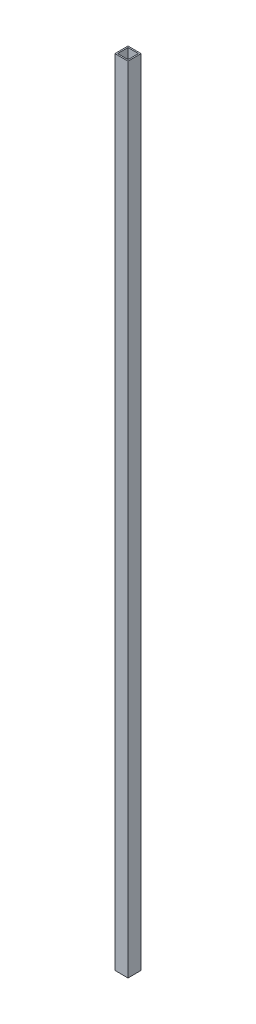
ISO-10303-21;
HEADER;
FILE_DESCRIPTION(('STEP AP214'),'2;1');
FILE_NAME('part.step','',(''),(''),'','','');
FILE_SCHEMA(('AUTOMOTIVE_DESIGN { 1 0 10303 214 1 1 1 1 }'));
ENDSEC;
DATA;
#1=APPLICATION_CONTEXT('core data for automotive mechanical design processes');
#2=APPLICATION_PROTOCOL_DEFINITION('international standard','automotive_design',2000,#1);
#3=PRODUCT_CONTEXT('',#1,'mechanical');
#4=PRODUCT('Part','Part','',(#3));
#5=PRODUCT_RELATED_PRODUCT_CATEGORY('part','',(#4));
#6=PRODUCT_DEFINITION_FORMATION('','',#4);
#7=PRODUCT_DEFINITION_CONTEXT('part definition',#1,'design');
#8=PRODUCT_DEFINITION('design','',#6,#7);
#9=PRODUCT_DEFINITION_SHAPE('','',#8);
#10=(LENGTH_UNIT() NAMED_UNIT(*) SI_UNIT(.MILLI.,.METRE.));
#11=(NAMED_UNIT(*) PLANE_ANGLE_UNIT() SI_UNIT($,.RADIAN.));
#12=(NAMED_UNIT(*) SI_UNIT($,.STERADIAN.) SOLID_ANGLE_UNIT());
#13=UNCERTAINTY_MEASURE_WITH_UNIT(LENGTH_MEASURE(1.E-05),#10,'distance_accuracy_value','');
#14=(GEOMETRIC_REPRESENTATION_CONTEXT(3) GLOBAL_UNCERTAINTY_ASSIGNED_CONTEXT((#13)) GLOBAL_UNIT_ASSIGNED_CONTEXT((#10,
#11,#12)) REPRESENTATION_CONTEXT('',''));
#15=CARTESIAN_POINT('',(0.,0.,0.));
#16=DIRECTION('',(0.,0.,1.));
#17=DIRECTION('',(1.,0.,0.));
#18=AXIS2_PLACEMENT_3D('',#15,#16,#17);
#19=CARTESIAN_POINT('',(0.,605.,0.));
#20=DIRECTION('',(0.,1.,0.));
#21=DIRECTION('',(0.,0.,1.));
#22=AXIS2_PLACEMENT_3D('',#19,#20,#21);
#23=PLANE('',#22);
#24=DIRECTION('',(0.,0.,-1.));
#25=VECTOR('',#24,1.);
#26=CARTESIAN_POINT('',(5.,605.,-5.));
#27=LINE('',#26,#25);
#28=CARTESIAN_POINT('',(5.,605.,5.));
#29=VERTEX_POINT('',#28);
#30=CARTESIAN_POINT('',(5.,605.,-5.));
#31=VERTEX_POINT('',#30);
#32=EDGE_CURVE('E139',#29,#31,#27,.T.);
#33=ORIENTED_EDGE('',*,*,#32,.T.);
#34=DIRECTION('',(-1.,0.,0.));
#35=VECTOR('',#34,1.);
#36=CARTESIAN_POINT('',(-5.,605.,-5.));
#37=LINE('',#36,#35);
#38=CARTESIAN_POINT('',(-5.,605.,-5.));
#39=VERTEX_POINT('',#38);
#40=EDGE_CURVE('E142',#31,#39,#37,.T.);
#41=ORIENTED_EDGE('',*,*,#40,.T.);
#42=DIRECTION('',(0.,0.,1.));
#43=VECTOR('',#42,1.);
#44=CARTESIAN_POINT('',(-5.,605.,-5.));
#45=LINE('',#44,#43);
#46=CARTESIAN_POINT('',(-5.,605.,5.));
#47=VERTEX_POINT('',#46);
#48=EDGE_CURVE('E145',#39,#47,#45,.T.);
#49=ORIENTED_EDGE('',*,*,#48,.T.);
#50=DIRECTION('',(1.,0.,0.));
#51=VECTOR('',#50,1.);
#52=CARTESIAN_POINT('',(-5.,605.,5.));
#53=LINE('',#52,#51);
#54=EDGE_CURVE('E147',#47,#29,#53,.T.);
#55=ORIENTED_EDGE('',*,*,#54,.T.);
#56=EDGE_LOOP('',(#33,#41,#49,#55));
#57=FACE_BOUND('',#56,.T.);
#58=DIRECTION('',(-1.,0.,0.));
#59=VECTOR('',#58,1.);
#60=CARTESIAN_POINT('',(-4.,605.,-4.));
#61=LINE('',#60,#59);
#62=CARTESIAN_POINT('',(4.,605.,-4.));
#63=VERTEX_POINT('',#62);
#64=CARTESIAN_POINT('',(-4.,605.,-4.));
#65=VERTEX_POINT('',#64);
#66=EDGE_CURVE('E109',#63,#65,#61,.T.);
#67=ORIENTED_EDGE('',*,*,#66,.F.);
#68=DIRECTION('',(0.,0.,-1.));
#69=VECTOR('',#68,1.);
#70=CARTESIAN_POINT('',(4.,605.,-4.));
#71=LINE('',#70,#69);
#72=CARTESIAN_POINT('',(4.,605.,4.));
#73=VERTEX_POINT('',#72);
#74=EDGE_CURVE('E101',#73,#63,#71,.T.);
#75=ORIENTED_EDGE('',*,*,#74,.F.);
#76=DIRECTION('',(1.,0.,0.));
#77=VECTOR('',#76,1.);
#78=CARTESIAN_POINT('',(-4.,605.,4.));
#79=LINE('',#78,#77);
#80=CARTESIAN_POINT('',(-4.,605.,4.));
#81=VERTEX_POINT('',#80);
#82=EDGE_CURVE('E123',#81,#73,#79,.T.);
#83=ORIENTED_EDGE('',*,*,#82,.F.);
#84=DIRECTION('',(0.,0.,1.));
#85=VECTOR('',#84,1.);
#86=CARTESIAN_POINT('',(-4.,605.,-4.));
#87=LINE('',#86,#85);
#88=EDGE_CURVE('E121',#65,#81,#87,.T.);
#89=ORIENTED_EDGE('',*,*,#88,.F.);
#90=EDGE_LOOP('',(#67,#75,#83,#89));
#91=FACE_BOUND('',#90,.T.);
#92=ADVANCED_FACE('F36',(#57,#91),#23,.T.);
#93=CARTESIAN_POINT('',(0.,0.,0.));
#94=DIRECTION('',(0.,1.,0.));
#95=DIRECTION('',(0.,0.,1.));
#96=AXIS2_PLACEMENT_3D('',#93,#94,#95);
#97=PLANE('',#96);
#98=DIRECTION('',(0.,0.,-1.));
#99=VECTOR('',#98,1.);
#100=CARTESIAN_POINT('',(5.,0.,-5.));
#101=LINE('',#100,#99);
#102=CARTESIAN_POINT('',(5.,0.,5.));
#103=VERTEX_POINT('',#102);
#104=CARTESIAN_POINT('',(5.,0.,-5.));
#105=VERTEX_POINT('',#104);
#106=EDGE_CURVE('E117',#103,#105,#101,.T.);
#107=ORIENTED_EDGE('',*,*,#106,.F.);
#108=DIRECTION('',(1.,0.,0.));
#109=VECTOR('',#108,1.);
#110=CARTESIAN_POINT('',(-5.,0.,5.));
#111=LINE('',#110,#109);
#112=CARTESIAN_POINT('',(-5.,0.,5.));
#113=VERTEX_POINT('',#112);
#114=EDGE_CURVE('E143',#113,#103,#111,.T.);
#115=ORIENTED_EDGE('',*,*,#114,.F.);
#116=DIRECTION('',(0.,0.,1.));
#117=VECTOR('',#116,1.);
#118=CARTESIAN_POINT('',(-5.,0.,-5.));
#119=LINE('',#118,#117);
#120=CARTESIAN_POINT('',(-5.,0.,-5.));
#121=VERTEX_POINT('',#120);
#122=EDGE_CURVE('E154',#121,#113,#119,.T.);
#123=ORIENTED_EDGE('',*,*,#122,.F.);
#124=DIRECTION('',(-1.,0.,0.));
#125=VECTOR('',#124,1.);
#126=CARTESIAN_POINT('',(-5.,0.,-5.));
#127=LINE('',#126,#125);
#128=EDGE_CURVE('E152',#105,#121,#127,.T.);
#129=ORIENTED_EDGE('',*,*,#128,.F.);
#130=EDGE_LOOP('',(#107,#115,#123,#129));
#131=FACE_BOUND('',#130,.T.);
#132=DIRECTION('',(0.,0.,-1.));
#133=VECTOR('',#132,1.);
#134=CARTESIAN_POINT('',(4.,0.,-4.));
#135=LINE('',#134,#133);
#136=CARTESIAN_POINT('',(4.,0.,4.));
#137=VERTEX_POINT('',#136);
#138=CARTESIAN_POINT('',(4.,0.,-4.));
#139=VERTEX_POINT('',#138);
#140=EDGE_CURVE('E59',#137,#139,#135,.T.);
#141=ORIENTED_EDGE('',*,*,#140,.T.);
#142=DIRECTION('',(-1.,0.,0.));
#143=VECTOR('',#142,1.);
#144=CARTESIAN_POINT('',(-4.,0.,-4.));
#145=LINE('',#144,#143);
#146=CARTESIAN_POINT('',(-4.,0.,-4.));
#147=VERTEX_POINT('',#146);
#148=EDGE_CURVE('E116',#139,#147,#145,.T.);
#149=ORIENTED_EDGE('',*,*,#148,.T.);
#150=DIRECTION('',(0.,0.,1.));
#151=VECTOR('',#150,1.);
#152=CARTESIAN_POINT('',(-4.,0.,-4.));
#153=LINE('',#152,#151);
#154=CARTESIAN_POINT('',(-4.,0.,4.));
#155=VERTEX_POINT('',#154);
#156=EDGE_CURVE('E131',#147,#155,#153,.T.);
#157=ORIENTED_EDGE('',*,*,#156,.T.);
#158=DIRECTION('',(1.,0.,0.));
#159=VECTOR('',#158,1.);
#160=CARTESIAN_POINT('',(-4.,0.,4.));
#161=LINE('',#160,#159);
#162=EDGE_CURVE('E110',#155,#137,#161,.T.);
#163=ORIENTED_EDGE('',*,*,#162,.T.);
#164=EDGE_LOOP('',(#141,#149,#157,#163));
#165=FACE_BOUND('',#164,.T.);
#166=ADVANCED_FACE('F172',(#131,#165),#97,.F.);
#167=CARTESIAN_POINT('',(5.,605.,-5.));
#168=DIRECTION('',(-1.,0.,0.));
#169=DIRECTION('',(0.,0.,1.));
#170=AXIS2_PLACEMENT_3D('',#167,#168,#169);
#171=PLANE('',#170);
#172=ORIENTED_EDGE('',*,*,#106,.T.);
#173=DIRECTION('',(0.,-1.,0.));
#174=VECTOR('',#173,1.);
#175=CARTESIAN_POINT('',(5.,605.,-5.));
#176=LINE('',#175,#174);
#177=EDGE_CURVE('E11',#31,#105,#176,.T.);
#178=ORIENTED_EDGE('',*,*,#177,.F.);
#179=ORIENTED_EDGE('',*,*,#32,.F.);
#180=DIRECTION('',(0.,-1.,0.));
#181=VECTOR('',#180,1.);
#182=CARTESIAN_POINT('',(5.,605.,5.));
#183=LINE('',#182,#181);
#184=EDGE_CURVE('E149',#29,#103,#183,.T.);
#185=ORIENTED_EDGE('',*,*,#184,.T.);
#186=EDGE_LOOP('',(#172,#178,#179,#185));
#187=FACE_BOUND('',#186,.T.);
#188=ADVANCED_FACE('F38',(#187),#171,.F.);
#189=CARTESIAN_POINT('',(-5.,605.,-5.));
#190=DIRECTION('',(0.,0.,1.));
#191=DIRECTION('',(1.,0.,0.));
#192=AXIS2_PLACEMENT_3D('',#189,#190,#191);
#193=PLANE('',#192);
#194=ORIENTED_EDGE('',*,*,#128,.T.);
#195=DIRECTION('',(0.,-1.,0.));
#196=VECTOR('',#195,1.);
#197=CARTESIAN_POINT('',(-5.,605.,-5.));
#198=LINE('',#197,#196);
#199=EDGE_CURVE('E44',#39,#121,#198,.T.);
#200=ORIENTED_EDGE('',*,*,#199,.F.);
#201=ORIENTED_EDGE('',*,*,#40,.F.);
#202=ORIENTED_EDGE('',*,*,#177,.T.);
#203=EDGE_LOOP('',(#194,#200,#201,#202));
#204=FACE_BOUND('',#203,.T.);
#205=ADVANCED_FACE('F182',(#204),#193,.F.);
#206=CARTESIAN_POINT('',(-5.,605.,-5.));
#207=DIRECTION('',(1.,0.,0.));
#208=DIRECTION('',(0.,0.,-1.));
#209=AXIS2_PLACEMENT_3D('',#206,#207,#208);
#210=PLANE('',#209);
#211=CARTESIAN_POINT('',(-5.,17.5,0.));
#212=DIRECTION('',(-1.,0.,0.));
#213=DIRECTION('',(0.,0.,1.));
#214=AXIS2_PLACEMENT_3D('',#211,#212,#213);
#215=CIRCLE('',#214,2.7);
#216=CARTESIAN_POINT('',(-5.,17.5,2.7));
#217=VERTEX_POINT('',#216);
#218=EDGE_CURVE('E129',#217,#217,#215,.T.);
#219=ORIENTED_EDGE('',*,*,#218,.F.);
#220=EDGE_LOOP('',(#219));
#221=FACE_BOUND('',#220,.T.);
#222=CARTESIAN_POINT('',(-5.,587.5,0.));
#223=DIRECTION('',(-1.,0.,0.));
#224=DIRECTION('',(0.,0.,1.));
#225=AXIS2_PLACEMENT_3D('',#222,#223,#224);
#226=CIRCLE('',#225,2.69999999999998);
#227=CARTESIAN_POINT('',(-5.,587.5,2.69999999999999));
#228=VERTEX_POINT('',#227);
#229=EDGE_CURVE('E232',#228,#228,#226,.T.);
#230=ORIENTED_EDGE('',*,*,#229,.F.);
#231=EDGE_LOOP('',(#230));
#232=FACE_BOUND('',#231,.T.);
#233=ORIENTED_EDGE('',*,*,#122,.T.);
#234=DIRECTION('',(0.,-1.,0.));
#235=VECTOR('',#234,1.);
#236=CARTESIAN_POINT('',(-5.,605.,5.));
#237=LINE('',#236,#235);
#238=EDGE_CURVE('E159',#47,#113,#237,.T.);
#239=ORIENTED_EDGE('',*,*,#238,.F.);
#240=ORIENTED_EDGE('',*,*,#48,.F.);
#241=ORIENTED_EDGE('',*,*,#199,.T.);
#242=EDGE_LOOP('',(#233,#239,#240,#241));
#243=FACE_BOUND('',#242,.T.);
#244=ADVANCED_FACE('F166',(#221,#232,#243),#210,.F.);
#245=CARTESIAN_POINT('',(-5.,605.,5.));
#246=DIRECTION('',(0.,0.,-1.));
#247=DIRECTION('',(-1.,0.,0.));
#248=AXIS2_PLACEMENT_3D('',#245,#246,#247);
#249=PLANE('',#248);
#250=ORIENTED_EDGE('',*,*,#114,.T.);
#251=ORIENTED_EDGE('',*,*,#184,.F.);
#252=ORIENTED_EDGE('',*,*,#54,.F.);
#253=ORIENTED_EDGE('',*,*,#238,.T.);
#254=EDGE_LOOP('',(#250,#251,#252,#253));
#255=FACE_BOUND('',#254,.T.);
#256=ADVANCED_FACE('F176',(#255),#249,.F.);
#257=CARTESIAN_POINT('',(4.,605.,-4.));
#258=DIRECTION('',(-1.,0.,0.));
#259=DIRECTION('',(0.,0.,1.));
#260=AXIS2_PLACEMENT_3D('',#257,#258,#259);
#261=PLANE('',#260);
#262=ORIENTED_EDGE('',*,*,#140,.F.);
#263=DIRECTION('',(0.,-1.,0.));
#264=VECTOR('',#263,1.);
#265=CARTESIAN_POINT('',(4.,605.,4.));
#266=LINE('',#265,#264);
#267=EDGE_CURVE('E105',#73,#137,#266,.T.);
#268=ORIENTED_EDGE('',*,*,#267,.F.);
#269=ORIENTED_EDGE('',*,*,#74,.T.);
#270=DIRECTION('',(0.,-1.,0.));
#271=VECTOR('',#270,1.);
#272=CARTESIAN_POINT('',(4.,605.,-4.));
#273=LINE('',#272,#271);
#274=EDGE_CURVE('E104',#63,#139,#273,.T.);
#275=ORIENTED_EDGE('',*,*,#274,.T.);
#276=EDGE_LOOP('',(#262,#268,#269,#275));
#277=FACE_BOUND('',#276,.T.);
#278=ADVANCED_FACE('F103',(#277),#261,.T.);
#279=CARTESIAN_POINT('',(-4.,605.,-4.));
#280=DIRECTION('',(0.,0.,1.));
#281=DIRECTION('',(1.,0.,0.));
#282=AXIS2_PLACEMENT_3D('',#279,#280,#281);
#283=PLANE('',#282);
#284=ORIENTED_EDGE('',*,*,#148,.F.);
#285=ORIENTED_EDGE('',*,*,#274,.F.);
#286=ORIENTED_EDGE('',*,*,#66,.T.);
#287=DIRECTION('',(0.,-1.,0.));
#288=VECTOR('',#287,1.);
#289=CARTESIAN_POINT('',(-4.,605.,-4.));
#290=LINE('',#289,#288);
#291=EDGE_CURVE('E118',#65,#147,#290,.T.);
#292=ORIENTED_EDGE('',*,*,#291,.T.);
#293=EDGE_LOOP('',(#284,#285,#286,#292));
#294=FACE_BOUND('',#293,.T.);
#295=ADVANCED_FACE('F113',(#294),#283,.T.);
#296=CARTESIAN_POINT('',(-4.,605.,-4.));
#297=DIRECTION('',(1.,0.,0.));
#298=DIRECTION('',(0.,0.,-1.));
#299=AXIS2_PLACEMENT_3D('',#296,#297,#298);
#300=PLANE('',#299);
#301=CARTESIAN_POINT('',(-4.,17.5,0.));
#302=DIRECTION('',(1.,0.,0.));
#303=DIRECTION('',(0.,0.,-1.));
#304=AXIS2_PLACEMENT_3D('',#301,#302,#303);
#305=CIRCLE('',#304,2.7);
#306=CARTESIAN_POINT('',(-4.,17.5,-2.7));
#307=VERTEX_POINT('',#306);
#308=EDGE_CURVE('E228',#307,#307,#305,.F.);
#309=ORIENTED_EDGE('',*,*,#308,.T.);
#310=EDGE_LOOP('',(#309));
#311=FACE_BOUND('',#310,.T.);
#312=CARTESIAN_POINT('',(-4.,587.5,0.));
#313=DIRECTION('',(1.,0.,0.));
#314=DIRECTION('',(0.,0.,-1.));
#315=AXIS2_PLACEMENT_3D('',#312,#313,#314);
#316=CIRCLE('',#315,2.69999999999998);
#317=CARTESIAN_POINT('',(-4.,587.5,-2.69999999999997));
#318=VERTEX_POINT('',#317);
#319=EDGE_CURVE('E236',#318,#318,#316,.F.);
#320=ORIENTED_EDGE('',*,*,#319,.T.);
#321=EDGE_LOOP('',(#320));
#322=FACE_BOUND('',#321,.T.);
#323=ORIENTED_EDGE('',*,*,#156,.F.);
#324=ORIENTED_EDGE('',*,*,#291,.F.);
#325=ORIENTED_EDGE('',*,*,#88,.T.);
#326=DIRECTION('',(0.,-1.,0.));
#327=VECTOR('',#326,1.);
#328=CARTESIAN_POINT('',(-4.,605.,4.));
#329=LINE('',#328,#327);
#330=EDGE_CURVE('E51',#81,#155,#329,.T.);
#331=ORIENTED_EDGE('',*,*,#330,.T.);
#332=EDGE_LOOP('',(#323,#324,#325,#331));
#333=FACE_BOUND('',#332,.T.);
#334=ADVANCED_FACE('F206',(#311,#322,#333),#300,.T.);
#335=CARTESIAN_POINT('',(-4.,605.,4.));
#336=DIRECTION('',(0.,0.,-1.));
#337=DIRECTION('',(-1.,0.,0.));
#338=AXIS2_PLACEMENT_3D('',#335,#336,#337);
#339=PLANE('',#338);
#340=ORIENTED_EDGE('',*,*,#162,.F.);
#341=ORIENTED_EDGE('',*,*,#330,.F.);
#342=ORIENTED_EDGE('',*,*,#82,.T.);
#343=ORIENTED_EDGE('',*,*,#267,.T.);
#344=EDGE_LOOP('',(#340,#341,#342,#343));
#345=FACE_BOUND('',#344,.T.);
#346=ADVANCED_FACE('F210',(#345),#339,.T.);
#347=CARTESIAN_POINT('',(5.001,587.5,0.));
#348=DIRECTION('',(-1.,0.,0.));
#349=DIRECTION('',(0.,0.,1.));
#350=AXIS2_PLACEMENT_3D('',#347,#348,#349);
#351=CYLINDRICAL_SURFACE('',#350,2.69999999999998);
#352=ORIENTED_EDGE('',*,*,#319,.F.);
#353=EDGE_LOOP('',(#352));
#354=FACE_BOUND('',#353,.T.);
#355=ORIENTED_EDGE('',*,*,#229,.T.);
#356=EDGE_LOOP('',(#355));
#357=FACE_BOUND('',#356,.T.);
#358=ADVANCED_FACE('F216',(#354,#357),#351,.F.);
#359=CARTESIAN_POINT('',(5.001,17.5,0.));
#360=DIRECTION('',(-1.,0.,0.));
#361=DIRECTION('',(0.,0.,1.));
#362=AXIS2_PLACEMENT_3D('',#359,#360,#361);
#363=CYLINDRICAL_SURFACE('',#362,2.7);
#364=ORIENTED_EDGE('',*,*,#308,.F.);
#365=EDGE_LOOP('',(#364));
#366=FACE_BOUND('',#365,.T.);
#367=ORIENTED_EDGE('',*,*,#218,.T.);
#368=EDGE_LOOP('',(#367));
#369=FACE_BOUND('',#368,.T.);
#370=ADVANCED_FACE('F219',(#366,#369),#363,.F.);
#371=CLOSED_SHELL('',(#92,#166,#188,#205,#244,#256,#278,#295,#334,#346,#358,#370));
#372=MANIFOLD_SOLID_BREP('B2',#371);
#373=ADVANCED_BREP_SHAPE_REPRESENTATION('',(#18,#372),#14);
#374=SHAPE_DEFINITION_REPRESENTATION(#9,#373);
ENDSEC;
END-ISO-10303-21;
